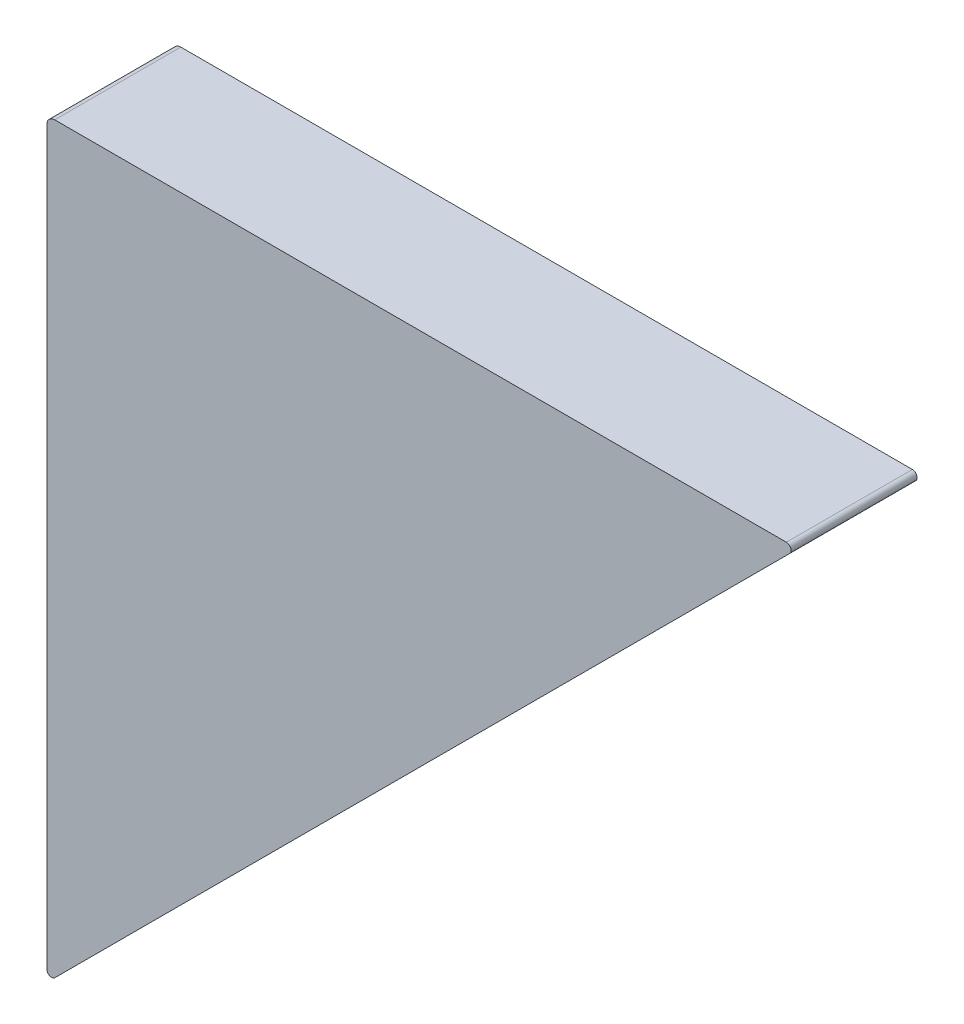
ISO-10303-21;
HEADER;
FILE_DESCRIPTION(('STEP AP214'),'2;1');
FILE_NAME('part.step','',(''),(''),'','','');
FILE_SCHEMA(('AUTOMOTIVE_DESIGN { 1 0 10303 214 1 1 1 1 }'));
ENDSEC;
DATA;
#1=APPLICATION_CONTEXT('core data for automotive mechanical design processes');
#2=APPLICATION_PROTOCOL_DEFINITION('international standard','automotive_design',2000,#1);
#3=PRODUCT_CONTEXT('',#1,'mechanical');
#4=PRODUCT('Part','Part','',(#3));
#5=PRODUCT_RELATED_PRODUCT_CATEGORY('part','',(#4));
#6=PRODUCT_DEFINITION_FORMATION('','',#4);
#7=PRODUCT_DEFINITION_CONTEXT('part definition',#1,'design');
#8=PRODUCT_DEFINITION('design','',#6,#7);
#9=PRODUCT_DEFINITION_SHAPE('','',#8);
#10=(LENGTH_UNIT() NAMED_UNIT(*) SI_UNIT(.MILLI.,.METRE.));
#11=(NAMED_UNIT(*) PLANE_ANGLE_UNIT() SI_UNIT($,.RADIAN.));
#12=(NAMED_UNIT(*) SI_UNIT($,.STERADIAN.) SOLID_ANGLE_UNIT());
#13=UNCERTAINTY_MEASURE_WITH_UNIT(LENGTH_MEASURE(1.E-05),#10,'distance_accuracy_value','');
#14=(GEOMETRIC_REPRESENTATION_CONTEXT(3) GLOBAL_UNCERTAINTY_ASSIGNED_CONTEXT((#13)) GLOBAL_UNIT_ASSIGNED_CONTEXT((#10,
#11,#12)) REPRESENTATION_CONTEXT('',''));
#15=CARTESIAN_POINT('',(0.,0.,0.));
#16=DIRECTION('',(0.,0.,1.));
#17=DIRECTION('',(1.,0.,0.));
#18=AXIS2_PLACEMENT_3D('',#15,#16,#17);
#19=CARTESIAN_POINT('',(0.499999999999992,47.1690475583122,8.));
#20=DIRECTION('',(0.,0.,-1.));
#21=DIRECTION('',(-1.,0.,0.));
#22=AXIS2_PLACEMENT_3D('',#19,#20,#21);
#23=CYLINDRICAL_SURFACE('',#22,0.499999999999993);
#24=CARTESIAN_POINT('',(0.499999999999992,47.1690475583122,0.));
#25=DIRECTION('',(0.,0.,1.));
#26=DIRECTION('',(-1.,0.,0.));
#27=AXIS2_PLACEMENT_3D('',#24,#25,#26);
#28=CIRCLE('',#27,0.499999999999993);
#29=CARTESIAN_POINT('',(0.499999999999991,47.6690475583122,0.));
#30=VERTEX_POINT('',#29);
#31=CARTESIAN_POINT('',(0.,47.1690475583122,0.));
#32=VERTEX_POINT('',#31);
#33=EDGE_CURVE('E117',#30,#32,#28,.T.);
#34=ORIENTED_EDGE('',*,*,#33,.T.);
#35=DIRECTION('',(0.,0.,-1.));
#36=VECTOR('',#35,1.);
#37=CARTESIAN_POINT('',(0.,47.1690475583122,8.));
#38=LINE('',#37,#36);
#39=CARTESIAN_POINT('',(0.,47.1690475583122,8.));
#40=VERTEX_POINT('',#39);
#41=EDGE_CURVE('E11',#40,#32,#38,.T.);
#42=ORIENTED_EDGE('',*,*,#41,.F.);
#43=CARTESIAN_POINT('',(0.499999999999992,47.1690475583122,8.));
#44=DIRECTION('',(0.,0.,1.));
#45=DIRECTION('',(-1.,0.,0.));
#46=AXIS2_PLACEMENT_3D('',#43,#44,#45);
#47=CIRCLE('',#46,0.499999999999993);
#48=CARTESIAN_POINT('',(0.499999999999991,47.6690475583122,8.));
#49=VERTEX_POINT('',#48);
#50=EDGE_CURVE('E127',#49,#40,#47,.T.);
#51=ORIENTED_EDGE('',*,*,#50,.F.);
#52=DIRECTION('',(0.,0.,-1.));
#53=VECTOR('',#52,1.);
#54=CARTESIAN_POINT('',(0.499999999999991,47.6690475583122,8.));
#55=LINE('',#54,#53);
#56=EDGE_CURVE('E113',#49,#30,#55,.T.);
#57=ORIENTED_EDGE('',*,*,#56,.T.);
#58=EDGE_LOOP('',(#34,#42,#51,#57));
#59=FACE_BOUND('',#58,.T.);
#60=ADVANCED_FACE('F33',(#59),#23,.T.);
#61=CARTESIAN_POINT('',(0.,0.724264068711943,8.));
#62=DIRECTION('',(1.,0.,0.));
#63=DIRECTION('',(0.,1.,0.));
#64=AXIS2_PLACEMENT_3D('',#61,#62,#63);
#65=PLANE('',#64);
#66=DIRECTION('',(0.,-1.,0.));
#67=VECTOR('',#66,1.);
#68=CARTESIAN_POINT('',(0.,0.724264068711943,0.));
#69=LINE('',#68,#67);
#70=CARTESIAN_POINT('',(0.,0.724264068711943,0.));
#71=VERTEX_POINT('',#70);
#72=EDGE_CURVE('E120',#32,#71,#69,.T.);
#73=ORIENTED_EDGE('',*,*,#72,.T.);
#74=DIRECTION('',(0.,0.,-1.));
#75=VECTOR('',#74,1.);
#76=CARTESIAN_POINT('',(0.,0.724264068711943,8.));
#77=LINE('',#76,#75);
#78=CARTESIAN_POINT('',(0.,0.724264068711943,8.));
#79=VERTEX_POINT('',#78);
#80=EDGE_CURVE('E41',#79,#71,#77,.T.);
#81=ORIENTED_EDGE('',*,*,#80,.F.);
#82=DIRECTION('',(0.,-1.,0.));
#83=VECTOR('',#82,1.);
#84=CARTESIAN_POINT('',(0.,0.724264068711943,8.));
#85=LINE('',#84,#83);
#86=EDGE_CURVE('E86',#40,#79,#85,.T.);
#87=ORIENTED_EDGE('',*,*,#86,.F.);
#88=ORIENTED_EDGE('',*,*,#41,.T.);
#89=EDGE_LOOP('',(#73,#81,#87,#88));
#90=FACE_BOUND('',#89,.T.);
#91=ADVANCED_FACE('F151',(#90),#65,.F.);
#92=CARTESIAN_POINT('',(0.3,0.724264068711943,8.));
#93=DIRECTION('',(0.,0.,-1.));
#94=DIRECTION('',(-1.,0.,0.));
#95=AXIS2_PLACEMENT_3D('',#92,#93,#94);
#96=CYLINDRICAL_SURFACE('',#95,0.300000000000006);
#97=CARTESIAN_POINT('',(0.3,0.724264068711943,0.));
#98=DIRECTION('',(0.,0.,1.));
#99=DIRECTION('',(1.,0.,0.));
#100=AXIS2_PLACEMENT_3D('',#97,#98,#99);
#101=CIRCLE('',#100,0.300000000000006);
#102=CARTESIAN_POINT('',(0.512132034355968,0.512132034355974,0.));
#103=VERTEX_POINT('',#102);
#104=EDGE_CURVE('E122',#71,#103,#101,.T.);
#105=ORIENTED_EDGE('',*,*,#104,.T.);
#106=DIRECTION('',(0.,0.,-1.));
#107=VECTOR('',#106,1.);
#108=CARTESIAN_POINT('',(0.512132034355968,0.512132034355974,8.));
#109=LINE('',#108,#107);
#110=CARTESIAN_POINT('',(0.512132034355968,0.512132034355974,8.));
#111=VERTEX_POINT('',#110);
#112=EDGE_CURVE('E108',#111,#103,#109,.T.);
#113=ORIENTED_EDGE('',*,*,#112,.F.);
#114=CARTESIAN_POINT('',(0.3,0.724264068711943,8.));
#115=DIRECTION('',(0.,0.,1.));
#116=DIRECTION('',(1.,0.,0.));
#117=AXIS2_PLACEMENT_3D('',#114,#115,#116);
#118=CIRCLE('',#117,0.300000000000006);
#119=EDGE_CURVE('E99',#79,#111,#118,.T.);
#120=ORIENTED_EDGE('',*,*,#119,.F.);
#121=ORIENTED_EDGE('',*,*,#80,.T.);
#122=EDGE_LOOP('',(#105,#113,#120,#121));
#123=FACE_BOUND('',#122,.T.);
#124=ADVANCED_FACE('F133',(#123),#96,.T.);
#125=CARTESIAN_POINT('',(47.1569155239562,47.1569155239562,8.));
#126=DIRECTION('',(-0.707106781186548,0.707106781186547,0.));
#127=DIRECTION('',(-0.707106781186547,-0.707106781186548,0.));
#128=AXIS2_PLACEMENT_3D('',#125,#126,#127);
#129=PLANE('',#128);
#130=DIRECTION('',(0.707106781186547,0.707106781186548,0.));
#131=VECTOR('',#130,1.);
#132=CARTESIAN_POINT('',(47.1569155239562,47.1569155239562,0.));
#133=LINE('',#132,#131);
#134=CARTESIAN_POINT('',(47.1569155239562,47.1569155239562,0.));
#135=VERTEX_POINT('',#134);
#136=EDGE_CURVE('E107',#103,#135,#133,.T.);
#137=ORIENTED_EDGE('',*,*,#136,.T.);
#138=DIRECTION('',(0.,0.,-1.));
#139=VECTOR('',#138,1.);
#140=CARTESIAN_POINT('',(47.1569155239562,47.1569155239562,8.));
#141=LINE('',#140,#139);
#142=CARTESIAN_POINT('',(47.1569155239562,47.1569155239562,8.));
#143=VERTEX_POINT('',#142);
#144=EDGE_CURVE('E104',#143,#135,#141,.T.);
#145=ORIENTED_EDGE('',*,*,#144,.F.);
#146=DIRECTION('',(0.707106781186547,0.707106781186548,0.));
#147=VECTOR('',#146,1.);
#148=CARTESIAN_POINT('',(47.1569155239562,47.1569155239562,8.));
#149=LINE('',#148,#147);
#150=EDGE_CURVE('E93',#111,#143,#149,.T.);
#151=ORIENTED_EDGE('',*,*,#150,.F.);
#152=ORIENTED_EDGE('',*,*,#112,.T.);
#153=EDGE_LOOP('',(#137,#145,#151,#152));
#154=FACE_BOUND('',#153,.T.);
#155=ADVANCED_FACE('F105',(#154),#129,.F.);
#156=CARTESIAN_POINT('',(46.9447834896002,47.3690475583122,8.));
#157=DIRECTION('',(0.,0.,-1.));
#158=DIRECTION('',(-1.,0.,0.));
#159=AXIS2_PLACEMENT_3D('',#156,#157,#158);
#160=CYLINDRICAL_SURFACE('',#159,0.299999999999996);
#161=CARTESIAN_POINT('',(46.9447834896002,47.3690475583122,0.));
#162=DIRECTION('',(0.,0.,1.));
#163=DIRECTION('',(-1.,0.,0.));
#164=AXIS2_PLACEMENT_3D('',#161,#162,#163);
#165=CIRCLE('',#164,0.299999999999996);
#166=CARTESIAN_POINT('',(46.9447834896002,47.6690475583122,0.));
#167=VERTEX_POINT('',#166);
#168=EDGE_CURVE('E72',#135,#167,#165,.T.);
#169=ORIENTED_EDGE('',*,*,#168,.T.);
#170=DIRECTION('',(0.,0.,-1.));
#171=VECTOR('',#170,1.);
#172=CARTESIAN_POINT('',(46.9447834896002,47.6690475583122,8.));
#173=LINE('',#172,#171);
#174=CARTESIAN_POINT('',(46.9447834896002,47.6690475583122,8.));
#175=VERTEX_POINT('',#174);
#176=EDGE_CURVE('E109',#175,#167,#173,.T.);
#177=ORIENTED_EDGE('',*,*,#176,.F.);
#178=CARTESIAN_POINT('',(46.9447834896002,47.3690475583122,8.));
#179=DIRECTION('',(0.,0.,1.));
#180=DIRECTION('',(-1.,0.,0.));
#181=AXIS2_PLACEMENT_3D('',#178,#179,#180);
#182=CIRCLE('',#181,0.299999999999996);
#183=EDGE_CURVE('E97',#143,#175,#182,.T.);
#184=ORIENTED_EDGE('',*,*,#183,.F.);
#185=ORIENTED_EDGE('',*,*,#144,.T.);
#186=EDGE_LOOP('',(#169,#177,#184,#185));
#187=FACE_BOUND('',#186,.T.);
#188=ADVANCED_FACE('F111',(#187),#160,.T.);
#189=CARTESIAN_POINT('',(0.499999999999991,47.6690475583122,8.));
#190=DIRECTION('',(0.,-1.,0.));
#191=DIRECTION('',(1.,0.,0.));
#192=AXIS2_PLACEMENT_3D('',#189,#190,#191);
#193=PLANE('',#192);
#194=DIRECTION('',(-1.,0.,0.));
#195=VECTOR('',#194,1.);
#196=CARTESIAN_POINT('',(0.499999999999991,47.6690475583122,0.));
#197=LINE('',#196,#195);
#198=EDGE_CURVE('E78',#167,#30,#197,.T.);
#199=ORIENTED_EDGE('',*,*,#198,.T.);
#200=ORIENTED_EDGE('',*,*,#56,.F.);
#201=DIRECTION('',(-1.,0.,0.));
#202=VECTOR('',#201,1.);
#203=CARTESIAN_POINT('',(0.499999999999991,47.6690475583122,8.));
#204=LINE('',#203,#202);
#205=EDGE_CURVE('E49',#175,#49,#204,.T.);
#206=ORIENTED_EDGE('',*,*,#205,.F.);
#207=ORIENTED_EDGE('',*,*,#176,.T.);
#208=EDGE_LOOP('',(#199,#200,#206,#207));
#209=FACE_BOUND('',#208,.T.);
#210=ADVANCED_FACE('F140',(#209),#193,.F.);
#211=CARTESIAN_POINT('',(0.499999999999992,47.1690475583122,8.));
#212=DIRECTION('',(0.,0.,-1.));
#213=DIRECTION('',(-1.,0.,0.));
#214=AXIS2_PLACEMENT_3D('',#211,#212,#213);
#215=PLANE('',#214);
#216=ORIENTED_EDGE('',*,*,#50,.T.);
#217=ORIENTED_EDGE('',*,*,#86,.T.);
#218=ORIENTED_EDGE('',*,*,#119,.T.);
#219=ORIENTED_EDGE('',*,*,#150,.T.);
#220=ORIENTED_EDGE('',*,*,#183,.T.);
#221=ORIENTED_EDGE('',*,*,#205,.T.);
#222=EDGE_LOOP('',(#216,#217,#218,#219,#220,#221));
#223=FACE_BOUND('',#222,.T.);
#224=ADVANCED_FACE('F95',(#223),#215,.F.);
#225=CARTESIAN_POINT('',(0.499999999999992,47.1690475583122,0.));
#226=DIRECTION('',(0.,0.,-1.));
#227=DIRECTION('',(-1.,0.,0.));
#228=AXIS2_PLACEMENT_3D('',#225,#226,#227);
#229=PLANE('',#228);
#230=ORIENTED_EDGE('',*,*,#33,.F.);
#231=ORIENTED_EDGE('',*,*,#198,.F.);
#232=ORIENTED_EDGE('',*,*,#168,.F.);
#233=ORIENTED_EDGE('',*,*,#136,.F.);
#234=ORIENTED_EDGE('',*,*,#104,.F.);
#235=ORIENTED_EDGE('',*,*,#72,.F.);
#236=EDGE_LOOP('',(#230,#231,#232,#233,#234,#235));
#237=FACE_BOUND('',#236,.T.);
#238=ADVANCED_FACE('F136',(#237),#229,.T.);
#239=CLOSED_SHELL('',(#60,#91,#124,#155,#188,#210,#224,#238));
#240=MANIFOLD_SOLID_BREP('B2',#239);
#241=ADVANCED_BREP_SHAPE_REPRESENTATION('',(#18,#240),#14);
#242=SHAPE_DEFINITION_REPRESENTATION(#9,#241);
ENDSEC;
END-ISO-10303-21;
